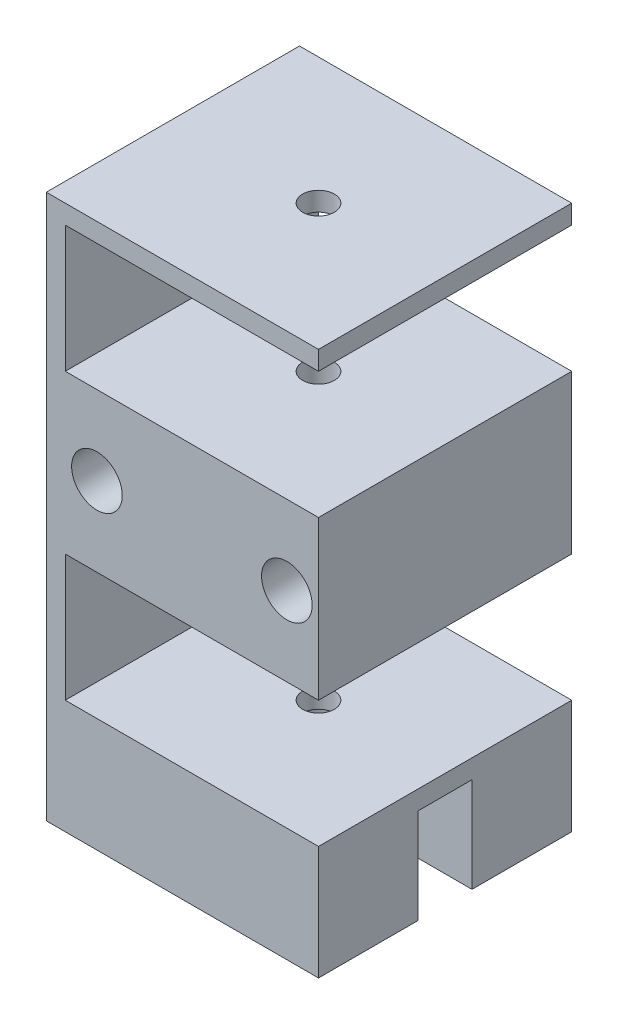
ISO-10303-21;
HEADER;
FILE_DESCRIPTION(('STEP AP214'),'2;1');
FILE_NAME('part.step','',(''),(''),'','','');
FILE_SCHEMA(('AUTOMOTIVE_DESIGN { 1 0 10303 214 1 1 1 1 }'));
ENDSEC;
DATA;
#1=APPLICATION_CONTEXT('core data for automotive mechanical design processes');
#2=APPLICATION_PROTOCOL_DEFINITION('international standard','automotive_design',2000,#1);
#3=PRODUCT_CONTEXT('',#1,'mechanical');
#4=PRODUCT('Part','Part','',(#3));
#5=PRODUCT_RELATED_PRODUCT_CATEGORY('part','',(#4));
#6=PRODUCT_DEFINITION_FORMATION('','',#4);
#7=PRODUCT_DEFINITION_CONTEXT('part definition',#1,'design');
#8=PRODUCT_DEFINITION('design','',#6,#7);
#9=PRODUCT_DEFINITION_SHAPE('','',#8);
#10=(LENGTH_UNIT() NAMED_UNIT(*) SI_UNIT(.MILLI.,.METRE.));
#11=(NAMED_UNIT(*) PLANE_ANGLE_UNIT() SI_UNIT($,.RADIAN.));
#12=(NAMED_UNIT(*) SI_UNIT($,.STERADIAN.) SOLID_ANGLE_UNIT());
#13=UNCERTAINTY_MEASURE_WITH_UNIT(LENGTH_MEASURE(1.E-05),#10,'distance_accuracy_value','');
#14=(GEOMETRIC_REPRESENTATION_CONTEXT(3) GLOBAL_UNCERTAINTY_ASSIGNED_CONTEXT((#13)) GLOBAL_UNIT_ASSIGNED_CONTEXT((#10,
#11,#12)) REPRESENTATION_CONTEXT('',''));
#15=CARTESIAN_POINT('',(0.,0.,0.));
#16=DIRECTION('',(0.,0.,1.));
#17=DIRECTION('',(1.,0.,0.));
#18=AXIS2_PLACEMENT_3D('',#15,#16,#17);
#19=CARTESIAN_POINT('',(-20.,68.,20.));
#20=DIRECTION('',(0.,-1.,0.));
#21=DIRECTION('',(1.,0.,0.));
#22=AXIS2_PLACEMENT_3D('',#19,#20,#21);
#23=CYLINDRICAL_SURFACE('',#22,2.5);
#24=CARTESIAN_POINT('',(-20.,0.,20.));
#25=DIRECTION('',(0.,-1.,0.));
#26=DIRECTION('',(1.,0.,0.));
#27=AXIS2_PLACEMENT_3D('',#24,#25,#26);
#28=CIRCLE('',#27,2.5);
#29=CARTESIAN_POINT('',(-17.5,0.,20.));
#30=VERTEX_POINT('',#29);
#31=EDGE_CURVE('E283',#30,#30,#28,.T.);
#32=ORIENTED_EDGE('',*,*,#31,.F.);
#33=EDGE_LOOP('',(#32));
#34=FACE_BOUND('',#33,.T.);
#35=CARTESIAN_POINT('',(-20.,-3.,20.));
#36=DIRECTION('',(0.,-1.,0.));
#37=DIRECTION('',(1.,0.,0.));
#38=AXIS2_PLACEMENT_3D('',#35,#36,#37);
#39=CIRCLE('',#38,2.5);
#40=CARTESIAN_POINT('',(-17.5,-3.,20.));
#41=VERTEX_POINT('',#40);
#42=EDGE_CURVE('E37',#41,#41,#39,.F.);
#43=ORIENTED_EDGE('',*,*,#42,.F.);
#44=EDGE_LOOP('',(#43));
#45=FACE_BOUND('',#44,.T.);
#46=ADVANCED_FACE('F33',(#34,#45),#23,.F.);
#47=CARTESIAN_POINT('',(0.,0.,40.));
#48=DIRECTION('',(0.,0.,-1.));
#49=DIRECTION('',(-1.,0.,0.));
#50=AXIS2_PLACEMENT_3D('',#47,#48,#49);
#51=PLANE('',#50);
#52=DIRECTION('',(0.,1.,0.));
#53=VECTOR('',#52,1.);
#54=CARTESIAN_POINT('',(0.,0.,40.));
#55=LINE('',#54,#53);
#56=CARTESIAN_POINT('',(0.,-18.,40.));
#57=VERTEX_POINT('',#56);
#58=CARTESIAN_POINT('',(0.,0.,40.));
#59=VERTEX_POINT('',#58);
#60=EDGE_CURVE('E193',#57,#59,#55,.T.);
#61=ORIENTED_EDGE('',*,*,#60,.T.);
#62=DIRECTION('',(-1.,0.,0.));
#63=VECTOR('',#62,1.);
#64=CARTESIAN_POINT('',(0.,0.,40.));
#65=LINE('',#64,#63);
#66=CARTESIAN_POINT('',(-40.,0.,40.));
#67=VERTEX_POINT('',#66);
#68=EDGE_CURVE('E112',#59,#67,#65,.T.);
#69=ORIENTED_EDGE('',*,*,#68,.T.);
#70=DIRECTION('',(0.,1.,0.));
#71=VECTOR('',#70,1.);
#72=CARTESIAN_POINT('',(-40.,0.,40.));
#73=LINE('',#72,#71);
#74=CARTESIAN_POINT('',(-40.,20.,40.));
#75=VERTEX_POINT('',#74);
#76=EDGE_CURVE('E223',#67,#75,#73,.T.);
#77=ORIENTED_EDGE('',*,*,#76,.T.);
#78=DIRECTION('',(1.,0.,0.));
#79=VECTOR('',#78,1.);
#80=CARTESIAN_POINT('',(-40.,20.,40.));
#81=LINE('',#80,#79);
#82=CARTESIAN_POINT('',(0.,20.,40.));
#83=VERTEX_POINT('',#82);
#84=EDGE_CURVE('E242',#75,#83,#81,.T.);
#85=ORIENTED_EDGE('',*,*,#84,.T.);
#86=DIRECTION('',(0.,1.,0.));
#87=VECTOR('',#86,1.);
#88=CARTESIAN_POINT('',(0.,20.,40.));
#89=LINE('',#88,#87);
#90=CARTESIAN_POINT('',(0.,45.,40.));
#91=VERTEX_POINT('',#90);
#92=EDGE_CURVE('E239',#83,#91,#89,.T.);
#93=ORIENTED_EDGE('',*,*,#92,.T.);
#94=DIRECTION('',(-1.,0.,0.));
#95=VECTOR('',#94,1.);
#96=CARTESIAN_POINT('',(0.,45.,40.));
#97=LINE('',#96,#95);
#98=CARTESIAN_POINT('',(-40.,45.,40.));
#99=VERTEX_POINT('',#98);
#100=EDGE_CURVE('E241',#91,#99,#97,.T.);
#101=ORIENTED_EDGE('',*,*,#100,.T.);
#102=DIRECTION('',(0.,1.,0.));
#103=VECTOR('',#102,1.);
#104=CARTESIAN_POINT('',(-40.,45.,40.));
#105=LINE('',#104,#103);
#106=CARTESIAN_POINT('',(-40.,65.,40.));
#107=VERTEX_POINT('',#106);
#108=EDGE_CURVE('E244',#99,#107,#105,.T.);
#109=ORIENTED_EDGE('',*,*,#108,.T.);
#110=DIRECTION('',(1.,0.,0.));
#111=VECTOR('',#110,1.);
#112=CARTESIAN_POINT('',(-40.,65.,40.));
#113=LINE('',#112,#111);
#114=CARTESIAN_POINT('',(0.,65.,40.));
#115=VERTEX_POINT('',#114);
#116=EDGE_CURVE('E250',#107,#115,#113,.T.);
#117=ORIENTED_EDGE('',*,*,#116,.T.);
#118=DIRECTION('',(0.,1.,0.));
#119=VECTOR('',#118,1.);
#120=CARTESIAN_POINT('',(0.,65.,40.));
#121=LINE('',#120,#119);
#122=CARTESIAN_POINT('',(0.,68.,40.));
#123=VERTEX_POINT('',#122);
#124=EDGE_CURVE('E148',#115,#123,#121,.T.);
#125=ORIENTED_EDGE('',*,*,#124,.T.);
#126=DIRECTION('',(-1.,0.,0.));
#127=VECTOR('',#126,1.);
#128=CARTESIAN_POINT('',(0.,68.,40.));
#129=LINE('',#128,#127);
#130=CARTESIAN_POINT('',(-43.,68.,40.));
#131=VERTEX_POINT('',#130);
#132=EDGE_CURVE('E140',#123,#131,#129,.T.);
#133=ORIENTED_EDGE('',*,*,#132,.T.);
#134=DIRECTION('',(0.,-1.,0.));
#135=VECTOR('',#134,1.);
#136=CARTESIAN_POINT('',(-43.,65.,40.));
#137=LINE('',#136,#135);
#138=CARTESIAN_POINT('',(-43.,-18.,40.));
#139=VERTEX_POINT('',#138);
#140=EDGE_CURVE('E145',#131,#139,#137,.T.);
#141=ORIENTED_EDGE('',*,*,#140,.T.);
#142=DIRECTION('',(1.,0.,0.));
#143=VECTOR('',#142,1.);
#144=CARTESIAN_POINT('',(0.,-18.,40.));
#145=LINE('',#144,#143);
#146=EDGE_CURVE('E58',#139,#57,#145,.T.);
#147=ORIENTED_EDGE('',*,*,#146,.T.);
#148=EDGE_LOOP('',(#61,#69,#77,#85,#93,#101,#109,#117,#125,#133,#141,#147));
#149=FACE_BOUND('',#148,.T.);
#150=CARTESIAN_POINT('',(-35.,32.5,40.));
#151=DIRECTION('',(0.,0.,1.));
#152=DIRECTION('',(1.,0.,0.));
#153=AXIS2_PLACEMENT_3D('',#150,#151,#152);
#154=CIRCLE('',#153,4.);
#155=CARTESIAN_POINT('',(-31.,32.5,40.));
#156=VERTEX_POINT('',#155);
#157=EDGE_CURVE('E172',#156,#156,#154,.T.);
#158=ORIENTED_EDGE('',*,*,#157,.F.);
#159=EDGE_LOOP('',(#158));
#160=FACE_BOUND('',#159,.T.);
#161=CARTESIAN_POINT('',(-5.,32.5,40.));
#162=DIRECTION('',(0.,0.,1.));
#163=DIRECTION('',(1.,0.,0.));
#164=AXIS2_PLACEMENT_3D('',#161,#162,#163);
#165=CIRCLE('',#164,4.);
#166=CARTESIAN_POINT('',(-0.999999999999997,32.5,40.));
#167=VERTEX_POINT('',#166);
#168=EDGE_CURVE('E277',#167,#167,#165,.T.);
#169=ORIENTED_EDGE('',*,*,#168,.F.);
#170=EDGE_LOOP('',(#169));
#171=FACE_BOUND('',#170,.T.);
#172=ADVANCED_FACE('F142',(#149,#160,#171),#51,.F.);
#173=CARTESIAN_POINT('',(0.,0.,0.));
#174=DIRECTION('',(0.,0.,-1.));
#175=DIRECTION('',(-1.,0.,0.));
#176=AXIS2_PLACEMENT_3D('',#173,#174,#175);
#177=PLANE('',#176);
#178=CARTESIAN_POINT('',(-35.,32.5,0.));
#179=DIRECTION('',(0.,0.,1.));
#180=DIRECTION('',(1.,0.,0.));
#181=AXIS2_PLACEMENT_3D('',#178,#179,#180);
#182=CIRCLE('',#181,4.);
#183=CARTESIAN_POINT('',(-31.,32.5,0.));
#184=VERTEX_POINT('',#183);
#185=EDGE_CURVE('E274',#184,#184,#182,.T.);
#186=ORIENTED_EDGE('',*,*,#185,.T.);
#187=EDGE_LOOP('',(#186));
#188=FACE_BOUND('',#187,.T.);
#189=DIRECTION('',(0.,1.,0.));
#190=VECTOR('',#189,1.);
#191=CARTESIAN_POINT('',(0.,0.,0.));
#192=LINE('',#191,#190);
#193=CARTESIAN_POINT('',(0.,-18.,0.));
#194=VERTEX_POINT('',#193);
#195=CARTESIAN_POINT('',(0.,0.,0.));
#196=VERTEX_POINT('',#195);
#197=EDGE_CURVE('E169',#194,#196,#192,.T.);
#198=ORIENTED_EDGE('',*,*,#197,.F.);
#199=DIRECTION('',(1.,0.,0.));
#200=VECTOR('',#199,1.);
#201=CARTESIAN_POINT('',(0.,-18.,0.));
#202=LINE('',#201,#200);
#203=CARTESIAN_POINT('',(-43.,-18.,0.));
#204=VERTEX_POINT('',#203);
#205=EDGE_CURVE('E191',#204,#194,#202,.T.);
#206=ORIENTED_EDGE('',*,*,#205,.F.);
#207=DIRECTION('',(0.,-1.,0.));
#208=VECTOR('',#207,1.);
#209=CARTESIAN_POINT('',(-43.,45.,0.));
#210=LINE('',#209,#208);
#211=CARTESIAN_POINT('',(-43.,68.,0.));
#212=VERTEX_POINT('',#211);
#213=EDGE_CURVE('E189',#212,#204,#210,.T.);
#214=ORIENTED_EDGE('',*,*,#213,.F.);
#215=DIRECTION('',(-1.,0.,0.));
#216=VECTOR('',#215,1.);
#217=CARTESIAN_POINT('',(0.,68.,0.));
#218=LINE('',#217,#216);
#219=CARTESIAN_POINT('',(0.,68.,0.));
#220=VERTEX_POINT('',#219);
#221=EDGE_CURVE('E158',#220,#212,#218,.T.);
#222=ORIENTED_EDGE('',*,*,#221,.F.);
#223=DIRECTION('',(0.,1.,0.));
#224=VECTOR('',#223,1.);
#225=CARTESIAN_POINT('',(0.,65.,0.));
#226=LINE('',#225,#224);
#227=CARTESIAN_POINT('',(0.,65.,0.));
#228=VERTEX_POINT('',#227);
#229=EDGE_CURVE('E186',#228,#220,#226,.T.);
#230=ORIENTED_EDGE('',*,*,#229,.F.);
#231=DIRECTION('',(1.,0.,0.));
#232=VECTOR('',#231,1.);
#233=CARTESIAN_POINT('',(-40.,65.,0.));
#234=LINE('',#233,#232);
#235=CARTESIAN_POINT('',(-40.,65.,0.));
#236=VERTEX_POINT('',#235);
#237=EDGE_CURVE('E184',#236,#228,#234,.T.);
#238=ORIENTED_EDGE('',*,*,#237,.F.);
#239=DIRECTION('',(0.,1.,0.));
#240=VECTOR('',#239,1.);
#241=CARTESIAN_POINT('',(-40.,45.,0.));
#242=LINE('',#241,#240);
#243=CARTESIAN_POINT('',(-40.,45.,0.));
#244=VERTEX_POINT('',#243);
#245=EDGE_CURVE('E182',#244,#236,#242,.T.);
#246=ORIENTED_EDGE('',*,*,#245,.F.);
#247=DIRECTION('',(-1.,0.,0.));
#248=VECTOR('',#247,1.);
#249=CARTESIAN_POINT('',(0.,45.,0.));
#250=LINE('',#249,#248);
#251=CARTESIAN_POINT('',(0.,45.,0.));
#252=VERTEX_POINT('',#251);
#253=EDGE_CURVE('E180',#252,#244,#250,.T.);
#254=ORIENTED_EDGE('',*,*,#253,.F.);
#255=DIRECTION('',(0.,1.,0.));
#256=VECTOR('',#255,1.);
#257=CARTESIAN_POINT('',(0.,20.,0.));
#258=LINE('',#257,#256);
#259=CARTESIAN_POINT('',(0.,20.,0.));
#260=VERTEX_POINT('',#259);
#261=EDGE_CURVE('E178',#260,#252,#258,.T.);
#262=ORIENTED_EDGE('',*,*,#261,.F.);
#263=DIRECTION('',(1.,0.,0.));
#264=VECTOR('',#263,1.);
#265=CARTESIAN_POINT('',(-40.,20.,0.));
#266=LINE('',#265,#264);
#267=CARTESIAN_POINT('',(-40.,20.,0.));
#268=VERTEX_POINT('',#267);
#269=EDGE_CURVE('E176',#268,#260,#266,.T.);
#270=ORIENTED_EDGE('',*,*,#269,.F.);
#271=DIRECTION('',(0.,1.,0.));
#272=VECTOR('',#271,1.);
#273=CARTESIAN_POINT('',(-40.,0.,0.));
#274=LINE('',#273,#272);
#275=CARTESIAN_POINT('',(-40.,0.,0.));
#276=VERTEX_POINT('',#275);
#277=EDGE_CURVE('E174',#276,#268,#274,.T.);
#278=ORIENTED_EDGE('',*,*,#277,.F.);
#279=DIRECTION('',(-1.,0.,0.));
#280=VECTOR('',#279,1.);
#281=CARTESIAN_POINT('',(0.,0.,0.));
#282=LINE('',#281,#280);
#283=EDGE_CURVE('E171',#196,#276,#282,.T.);
#284=ORIENTED_EDGE('',*,*,#283,.F.);
#285=EDGE_LOOP('',(#198,#206,#214,#222,#230,#238,#246,#254,#262,#270,#278,#284));
#286=FACE_BOUND('',#285,.T.);
#287=CARTESIAN_POINT('',(-5.,32.5,0.));
#288=DIRECTION('',(0.,0.,1.));
#289=DIRECTION('',(1.,0.,0.));
#290=AXIS2_PLACEMENT_3D('',#287,#288,#289);
#291=CIRCLE('',#290,4.);
#292=CARTESIAN_POINT('',(-0.999999999999997,32.5,0.));
#293=VERTEX_POINT('',#292);
#294=EDGE_CURVE('E280',#293,#293,#291,.T.);
#295=ORIENTED_EDGE('',*,*,#294,.T.);
#296=EDGE_LOOP('',(#295));
#297=FACE_BOUND('',#296,.T.);
#298=ADVANCED_FACE('F227',(#188,#286,#297),#177,.T.);
#299=CARTESIAN_POINT('',(0.,0.,40.));
#300=DIRECTION('',(-1.,0.,0.));
#301=DIRECTION('',(0.,-1.,0.));
#302=AXIS2_PLACEMENT_3D('',#299,#300,#301);
#303=PLANE('',#302);
#304=DIRECTION('',(0.,0.,-1.));
#305=VECTOR('',#304,1.);
#306=CARTESIAN_POINT('',(0.,-18.,40.));
#307=LINE('',#306,#305);
#308=CARTESIAN_POINT('',(0.,-18.,24.25));
#309=VERTEX_POINT('',#308);
#310=EDGE_CURVE('E194',#57,#309,#307,.T.);
#311=ORIENTED_EDGE('',*,*,#310,.T.);
#312=DIRECTION('',(0.,-1.,0.));
#313=VECTOR('',#312,1.);
#314=CARTESIAN_POINT('',(0.,-3.,24.25));
#315=LINE('',#314,#313);
#316=CARTESIAN_POINT('',(0.,-3.,24.25));
#317=VERTEX_POINT('',#316);
#318=EDGE_CURVE('E305',#317,#309,#315,.T.);
#319=ORIENTED_EDGE('',*,*,#318,.F.);
#320=DIRECTION('',(0.,0.,1.));
#321=VECTOR('',#320,1.);
#322=CARTESIAN_POINT('',(0.,-3.,24.25));
#323=LINE('',#322,#321);
#324=CARTESIAN_POINT('',(0.,-3.,15.75));
#325=VERTEX_POINT('',#324);
#326=EDGE_CURVE('E318',#325,#317,#323,.T.);
#327=ORIENTED_EDGE('',*,*,#326,.F.);
#328=DIRECTION('',(0.,-1.,0.));
#329=VECTOR('',#328,1.);
#330=CARTESIAN_POINT('',(0.,-3.,15.75));
#331=LINE('',#330,#329);
#332=CARTESIAN_POINT('',(0.,-18.,15.75));
#333=VERTEX_POINT('',#332);
#334=EDGE_CURVE('E302',#325,#333,#331,.T.);
#335=ORIENTED_EDGE('',*,*,#334,.T.);
#336=EDGE_CURVE('E104',#333,#194,#307,.T.);
#337=ORIENTED_EDGE('',*,*,#336,.T.);
#338=ORIENTED_EDGE('',*,*,#197,.T.);
#339=DIRECTION('',(0.,0.,-1.));
#340=VECTOR('',#339,1.);
#341=CARTESIAN_POINT('',(0.,0.,40.));
#342=LINE('',#341,#340);
#343=EDGE_CURVE('E11',#59,#196,#342,.T.);
#344=ORIENTED_EDGE('',*,*,#343,.F.);
#345=ORIENTED_EDGE('',*,*,#60,.F.);
#346=EDGE_LOOP('',(#311,#319,#327,#335,#337,#338,#344,#345));
#347=FACE_BOUND('',#346,.T.);
#348=ADVANCED_FACE('F35',(#347),#303,.F.);
#349=CARTESIAN_POINT('',(0.,0.,40.));
#350=DIRECTION('',(0.,-1.,0.));
#351=DIRECTION('',(1.,0.,0.));
#352=AXIS2_PLACEMENT_3D('',#349,#350,#351);
#353=PLANE('',#352);
#354=ORIENTED_EDGE('',*,*,#31,.T.);
#355=EDGE_LOOP('',(#354));
#356=FACE_BOUND('',#355,.T.);
#357=ORIENTED_EDGE('',*,*,#283,.T.);
#358=DIRECTION('',(0.,0.,-1.));
#359=VECTOR('',#358,1.);
#360=CARTESIAN_POINT('',(-40.,0.,40.));
#361=LINE('',#360,#359);
#362=EDGE_CURVE('E42',#67,#276,#361,.T.);
#363=ORIENTED_EDGE('',*,*,#362,.F.);
#364=ORIENTED_EDGE('',*,*,#68,.F.);
#365=ORIENTED_EDGE('',*,*,#343,.T.);
#366=EDGE_LOOP('',(#357,#363,#364,#365));
#367=FACE_BOUND('',#366,.T.);
#368=ADVANCED_FACE('F404',(#356,#367),#353,.F.);
#369=CARTESIAN_POINT('',(-40.,0.,40.));
#370=DIRECTION('',(-1.,0.,0.));
#371=DIRECTION('',(0.,0.,1.));
#372=AXIS2_PLACEMENT_3D('',#369,#370,#371);
#373=PLANE('',#372);
#374=ORIENTED_EDGE('',*,*,#277,.T.);
#375=DIRECTION('',(0.,0.,-1.));
#376=VECTOR('',#375,1.);
#377=CARTESIAN_POINT('',(-40.,20.,40.));
#378=LINE('',#377,#376);
#379=EDGE_CURVE('E214',#75,#268,#378,.T.);
#380=ORIENTED_EDGE('',*,*,#379,.F.);
#381=ORIENTED_EDGE('',*,*,#76,.F.);
#382=ORIENTED_EDGE('',*,*,#362,.T.);
#383=EDGE_LOOP('',(#374,#380,#381,#382));
#384=FACE_BOUND('',#383,.T.);
#385=ADVANCED_FACE('F221',(#384),#373,.F.);
#386=CARTESIAN_POINT('',(-40.,20.,40.));
#387=DIRECTION('',(0.,1.,0.));
#388=DIRECTION('',(-1.,0.,0.));
#389=AXIS2_PLACEMENT_3D('',#386,#387,#388);
#390=PLANE('',#389);
#391=CARTESIAN_POINT('',(-20.,20.,20.));
#392=DIRECTION('',(0.,1.,0.));
#393=DIRECTION('',(-1.,0.,0.));
#394=AXIS2_PLACEMENT_3D('',#391,#392,#393);
#395=CIRCLE('',#394,2.5);
#396=CARTESIAN_POINT('',(-22.5,20.,20.));
#397=VERTEX_POINT('',#396);
#398=EDGE_CURVE('E288',#397,#397,#395,.T.);
#399=ORIENTED_EDGE('',*,*,#398,.T.);
#400=EDGE_LOOP('',(#399));
#401=FACE_BOUND('',#400,.T.);
#402=ORIENTED_EDGE('',*,*,#269,.T.);
#403=DIRECTION('',(0.,0.,-1.));
#404=VECTOR('',#403,1.);
#405=CARTESIAN_POINT('',(0.,20.,40.));
#406=LINE('',#405,#404);
#407=EDGE_CURVE('E211',#83,#260,#406,.T.);
#408=ORIENTED_EDGE('',*,*,#407,.F.);
#409=ORIENTED_EDGE('',*,*,#84,.F.);
#410=ORIENTED_EDGE('',*,*,#379,.T.);
#411=EDGE_LOOP('',(#402,#408,#409,#410));
#412=FACE_BOUND('',#411,.T.);
#413=ADVANCED_FACE('F233',(#401,#412),#390,.F.);
#414=CARTESIAN_POINT('',(0.,20.,40.));
#415=DIRECTION('',(-1.,0.,0.));
#416=DIRECTION('',(0.,-1.,0.));
#417=AXIS2_PLACEMENT_3D('',#414,#415,#416);
#418=PLANE('',#417);
#419=ORIENTED_EDGE('',*,*,#261,.T.);
#420=DIRECTION('',(0.,0.,-1.));
#421=VECTOR('',#420,1.);
#422=CARTESIAN_POINT('',(0.,45.,40.));
#423=LINE('',#422,#421);
#424=EDGE_CURVE('E208',#91,#252,#423,.T.);
#425=ORIENTED_EDGE('',*,*,#424,.F.);
#426=ORIENTED_EDGE('',*,*,#92,.F.);
#427=ORIENTED_EDGE('',*,*,#407,.T.);
#428=EDGE_LOOP('',(#419,#425,#426,#427));
#429=FACE_BOUND('',#428,.T.);
#430=ADVANCED_FACE('F237',(#429),#418,.F.);
#431=CARTESIAN_POINT('',(0.,45.,40.));
#432=DIRECTION('',(0.,-1.,0.));
#433=DIRECTION('',(0.,0.,-1.));
#434=AXIS2_PLACEMENT_3D('',#431,#432,#433);
#435=PLANE('',#434);
#436=CARTESIAN_POINT('',(-20.,45.,20.));
#437=DIRECTION('',(0.,-1.,0.));
#438=DIRECTION('',(0.,0.,-1.));
#439=AXIS2_PLACEMENT_3D('',#436,#437,#438);
#440=CIRCLE('',#439,2.5);
#441=CARTESIAN_POINT('',(-20.,45.,17.5));
#442=VERTEX_POINT('',#441);
#443=EDGE_CURVE('E291',#442,#442,#440,.T.);
#444=ORIENTED_EDGE('',*,*,#443,.T.);
#445=EDGE_LOOP('',(#444));
#446=FACE_BOUND('',#445,.T.);
#447=ORIENTED_EDGE('',*,*,#253,.T.);
#448=DIRECTION('',(0.,0.,-1.));
#449=VECTOR('',#448,1.);
#450=CARTESIAN_POINT('',(-40.,45.,40.));
#451=LINE('',#450,#449);
#452=EDGE_CURVE('E205',#99,#244,#451,.T.);
#453=ORIENTED_EDGE('',*,*,#452,.F.);
#454=ORIENTED_EDGE('',*,*,#100,.F.);
#455=ORIENTED_EDGE('',*,*,#424,.T.);
#456=EDGE_LOOP('',(#447,#453,#454,#455));
#457=FACE_BOUND('',#456,.T.);
#458=ADVANCED_FACE('F390',(#446,#457),#435,.F.);
#459=CARTESIAN_POINT('',(-40.,45.,40.));
#460=DIRECTION('',(-1.,0.,0.));
#461=DIRECTION('',(0.,0.,1.));
#462=AXIS2_PLACEMENT_3D('',#459,#460,#461);
#463=PLANE('',#462);
#464=ORIENTED_EDGE('',*,*,#245,.T.);
#465=DIRECTION('',(0.,0.,-1.));
#466=VECTOR('',#465,1.);
#467=CARTESIAN_POINT('',(-40.,65.,40.));
#468=LINE('',#467,#466);
#469=EDGE_CURVE('E202',#107,#236,#468,.T.);
#470=ORIENTED_EDGE('',*,*,#469,.F.);
#471=ORIENTED_EDGE('',*,*,#108,.F.);
#472=ORIENTED_EDGE('',*,*,#452,.T.);
#473=EDGE_LOOP('',(#464,#470,#471,#472));
#474=FACE_BOUND('',#473,.T.);
#475=ADVANCED_FACE('F383',(#474),#463,.F.);
#476=CARTESIAN_POINT('',(-40.,65.,40.));
#477=DIRECTION('',(0.,1.,0.));
#478=DIRECTION('',(0.,0.,1.));
#479=AXIS2_PLACEMENT_3D('',#476,#477,#478);
#480=PLANE('',#479);
#481=CARTESIAN_POINT('',(-20.,65.,20.));
#482=DIRECTION('',(0.,1.,0.));
#483=DIRECTION('',(0.,0.,1.));
#484=AXIS2_PLACEMENT_3D('',#481,#482,#483);
#485=CIRCLE('',#484,2.5);
#486=CARTESIAN_POINT('',(-20.,65.,22.5));
#487=VERTEX_POINT('',#486);
#488=EDGE_CURVE('E294',#487,#487,#485,.T.);
#489=ORIENTED_EDGE('',*,*,#488,.T.);
#490=EDGE_LOOP('',(#489));
#491=FACE_BOUND('',#490,.T.);
#492=ORIENTED_EDGE('',*,*,#237,.T.);
#493=DIRECTION('',(0.,0.,-1.));
#494=VECTOR('',#493,1.);
#495=CARTESIAN_POINT('',(0.,65.,40.));
#496=LINE('',#495,#494);
#497=EDGE_CURVE('E199',#115,#228,#496,.T.);
#498=ORIENTED_EDGE('',*,*,#497,.F.);
#499=ORIENTED_EDGE('',*,*,#116,.F.);
#500=ORIENTED_EDGE('',*,*,#469,.T.);
#501=EDGE_LOOP('',(#492,#498,#499,#500));
#502=FACE_BOUND('',#501,.T.);
#503=ADVANCED_FACE('F256',(#491,#502),#480,.F.);
#504=CARTESIAN_POINT('',(0.,65.,40.));
#505=DIRECTION('',(-1.,0.,0.));
#506=DIRECTION('',(0.,-1.,0.));
#507=AXIS2_PLACEMENT_3D('',#504,#505,#506);
#508=PLANE('',#507);
#509=ORIENTED_EDGE('',*,*,#229,.T.);
#510=DIRECTION('',(0.,0.,-1.));
#511=VECTOR('',#510,1.);
#512=CARTESIAN_POINT('',(0.,68.,40.));
#513=LINE('',#512,#511);
#514=EDGE_CURVE('E160',#123,#220,#513,.T.);
#515=ORIENTED_EDGE('',*,*,#514,.F.);
#516=ORIENTED_EDGE('',*,*,#124,.F.);
#517=ORIENTED_EDGE('',*,*,#497,.T.);
#518=EDGE_LOOP('',(#509,#515,#516,#517));
#519=FACE_BOUND('',#518,.T.);
#520=ADVANCED_FACE('F260',(#519),#508,.F.);
#521=CARTESIAN_POINT('',(0.,68.,40.));
#522=DIRECTION('',(0.,-1.,0.));
#523=DIRECTION('',(0.,0.,-1.));
#524=AXIS2_PLACEMENT_3D('',#521,#522,#523);
#525=PLANE('',#524);
#526=CARTESIAN_POINT('',(-20.,68.,20.));
#527=DIRECTION('',(0.,-1.,0.));
#528=DIRECTION('',(1.,0.,0.));
#529=AXIS2_PLACEMENT_3D('',#526,#527,#528);
#530=CIRCLE('',#529,2.5);
#531=CARTESIAN_POINT('',(-17.5,68.,20.));
#532=VERTEX_POINT('',#531);
#533=EDGE_CURVE('E297',#532,#532,#530,.T.);
#534=ORIENTED_EDGE('',*,*,#533,.T.);
#535=EDGE_LOOP('',(#534));
#536=FACE_BOUND('',#535,.T.);
#537=ORIENTED_EDGE('',*,*,#221,.T.);
#538=DIRECTION('',(0.,0.,-1.));
#539=VECTOR('',#538,1.);
#540=CARTESIAN_POINT('',(-43.,68.,40.));
#541=LINE('',#540,#539);
#542=EDGE_CURVE('E155',#131,#212,#541,.T.);
#543=ORIENTED_EDGE('',*,*,#542,.F.);
#544=ORIENTED_EDGE('',*,*,#132,.F.);
#545=ORIENTED_EDGE('',*,*,#514,.T.);
#546=EDGE_LOOP('',(#537,#543,#544,#545));
#547=FACE_BOUND('',#546,.T.);
#548=ADVANCED_FACE('F156',(#536,#547),#525,.F.);
#549=CARTESIAN_POINT('',(-43.,45.,40.));
#550=DIRECTION('',(1.,0.,0.));
#551=DIRECTION('',(0.,1.,0.));
#552=AXIS2_PLACEMENT_3D('',#549,#550,#551);
#553=PLANE('',#552);
#554=ORIENTED_EDGE('',*,*,#213,.T.);
#555=DIRECTION('',(0.,0.,-1.));
#556=VECTOR('',#555,1.);
#557=CARTESIAN_POINT('',(-43.,-18.,40.));
#558=LINE('',#557,#556);
#559=EDGE_CURVE('E161',#139,#204,#558,.T.);
#560=ORIENTED_EDGE('',*,*,#559,.F.);
#561=ORIENTED_EDGE('',*,*,#140,.F.);
#562=ORIENTED_EDGE('',*,*,#542,.T.);
#563=EDGE_LOOP('',(#554,#560,#561,#562));
#564=FACE_BOUND('',#563,.T.);
#565=ADVANCED_FACE('F163',(#564),#553,.F.);
#566=CARTESIAN_POINT('',(0.,-18.,40.));
#567=DIRECTION('',(0.,1.,0.));
#568=DIRECTION('',(-1.,0.,0.));
#569=AXIS2_PLACEMENT_3D('',#566,#567,#568);
#570=PLANE('',#569);
#571=CARTESIAN_POINT('',(-20.,-18.,20.));
#572=DIRECTION('',(0.,-1.,0.));
#573=DIRECTION('',(1.,0.,0.));
#574=AXIS2_PLACEMENT_3D('',#571,#572,#573);
#575=CIRCLE('',#574,4.25);
#576=CARTESIAN_POINT('',(-20.,-18.,24.25));
#577=VERTEX_POINT('',#576);
#578=CARTESIAN_POINT('',(-20.,-18.,15.75));
#579=VERTEX_POINT('',#578);
#580=EDGE_CURVE('E49',#577,#579,#575,.T.);
#581=ORIENTED_EDGE('',*,*,#580,.F.);
#582=DIRECTION('',(-1.,0.,0.));
#583=VECTOR('',#582,1.);
#584=CARTESIAN_POINT('',(-20.,-18.,24.25));
#585=LINE('',#584,#583);
#586=EDGE_CURVE('E268',#309,#577,#585,.T.);
#587=ORIENTED_EDGE('',*,*,#586,.F.);
#588=ORIENTED_EDGE('',*,*,#310,.F.);
#589=ORIENTED_EDGE('',*,*,#146,.F.);
#590=ORIENTED_EDGE('',*,*,#559,.T.);
#591=ORIENTED_EDGE('',*,*,#205,.T.);
#592=ORIENTED_EDGE('',*,*,#336,.F.);
#593=DIRECTION('',(1.,0.,0.));
#594=VECTOR('',#593,1.);
#595=CARTESIAN_POINT('',(0.,-18.,15.75));
#596=LINE('',#595,#594);
#597=EDGE_CURVE('E312',#579,#333,#596,.T.);
#598=ORIENTED_EDGE('',*,*,#597,.F.);
#599=EDGE_LOOP('',(#581,#587,#588,#589,#590,#591,#592,#598));
#600=FACE_BOUND('',#599,.T.);
#601=ADVANCED_FACE('F263',(#600),#570,.F.);
#602=CARTESIAN_POINT('',(-35.,32.5,40.));
#603=DIRECTION('',(0.,0.,-1.));
#604=DIRECTION('',(-1.,0.,0.));
#605=AXIS2_PLACEMENT_3D('',#602,#603,#604);
#606=CYLINDRICAL_SURFACE('',#605,4.);
#607=ORIENTED_EDGE('',*,*,#157,.T.);
#608=EDGE_LOOP('',(#607));
#609=FACE_BOUND('',#608,.T.);
#610=ORIENTED_EDGE('',*,*,#185,.F.);
#611=EDGE_LOOP('',(#610));
#612=FACE_BOUND('',#611,.T.);
#613=ADVANCED_FACE('F376',(#609,#612),#606,.F.);
#614=CARTESIAN_POINT('',(-5.,32.5,40.));
#615=DIRECTION('',(0.,0.,-1.));
#616=DIRECTION('',(-1.,0.,0.));
#617=AXIS2_PLACEMENT_3D('',#614,#615,#616);
#618=CYLINDRICAL_SURFACE('',#617,4.);
#619=ORIENTED_EDGE('',*,*,#168,.T.);
#620=EDGE_LOOP('',(#619));
#621=FACE_BOUND('',#620,.T.);
#622=ORIENTED_EDGE('',*,*,#294,.F.);
#623=EDGE_LOOP('',(#622));
#624=FACE_BOUND('',#623,.T.);
#625=ADVANCED_FACE('F371',(#621,#624),#618,.F.);
#626=ORIENTED_EDGE('',*,*,#533,.F.);
#627=EDGE_LOOP('',(#626));
#628=FACE_BOUND('',#627,.T.);
#629=ORIENTED_EDGE('',*,*,#488,.F.);
#630=EDGE_LOOP('',(#629));
#631=FACE_BOUND('',#630,.T.);
#632=ADVANCED_FACE('F360',(#628,#631),#23,.F.);
#633=ORIENTED_EDGE('',*,*,#443,.F.);
#634=EDGE_LOOP('',(#633));
#635=FACE_BOUND('',#634,.T.);
#636=ORIENTED_EDGE('',*,*,#398,.F.);
#637=EDGE_LOOP('',(#636));
#638=FACE_BOUND('',#637,.T.);
#639=ADVANCED_FACE('F359',(#635,#638),#23,.F.);
#640=CARTESIAN_POINT('',(-20.,-3.,20.));
#641=DIRECTION('',(0.,-1.,0.));
#642=DIRECTION('',(1.,0.,0.));
#643=AXIS2_PLACEMENT_3D('',#640,#641,#642);
#644=PLANE('',#643);
#645=CARTESIAN_POINT('',(-20.,-3.,20.));
#646=DIRECTION('',(0.,-1.,0.));
#647=DIRECTION('',(1.,0.,0.));
#648=AXIS2_PLACEMENT_3D('',#645,#646,#647);
#649=CIRCLE('',#648,4.25);
#650=CARTESIAN_POINT('',(-20.,-3.,24.25));
#651=VERTEX_POINT('',#650);
#652=CARTESIAN_POINT('',(-20.,-3.,15.75));
#653=VERTEX_POINT('',#652);
#654=EDGE_CURVE('E311',#651,#653,#649,.T.);
#655=ORIENTED_EDGE('',*,*,#654,.T.);
#656=DIRECTION('',(1.,0.,0.));
#657=VECTOR('',#656,1.);
#658=CARTESIAN_POINT('',(0.,-3.,15.75));
#659=LINE('',#658,#657);
#660=EDGE_CURVE('E321',#653,#325,#659,.T.);
#661=ORIENTED_EDGE('',*,*,#660,.T.);
#662=ORIENTED_EDGE('',*,*,#326,.T.);
#663=DIRECTION('',(-1.,0.,0.));
#664=VECTOR('',#663,1.);
#665=CARTESIAN_POINT('',(-20.,-3.,24.25));
#666=LINE('',#665,#664);
#667=EDGE_CURVE('E303',#317,#651,#666,.T.);
#668=ORIENTED_EDGE('',*,*,#667,.T.);
#669=EDGE_LOOP('',(#655,#661,#662,#668));
#670=FACE_BOUND('',#669,.T.);
#671=ORIENTED_EDGE('',*,*,#42,.T.);
#672=EDGE_LOOP('',(#671));
#673=FACE_BOUND('',#672,.T.);
#674=ADVANCED_FACE('F328',(#670,#673),#644,.T.);
#675=CARTESIAN_POINT('',(-20.,-3.,20.));
#676=DIRECTION('',(0.,-1.,0.));
#677=DIRECTION('',(1.,0.,0.));
#678=AXIS2_PLACEMENT_3D('',#675,#676,#677);
#679=CYLINDRICAL_SURFACE('',#678,4.25);
#680=ORIENTED_EDGE('',*,*,#580,.T.);
#681=DIRECTION('',(0.,-1.,0.));
#682=VECTOR('',#681,1.);
#683=CARTESIAN_POINT('',(-20.,-3.,15.75));
#684=LINE('',#683,#682);
#685=EDGE_CURVE('E300',#653,#579,#684,.T.);
#686=ORIENTED_EDGE('',*,*,#685,.F.);
#687=ORIENTED_EDGE('',*,*,#654,.F.);
#688=DIRECTION('',(0.,-1.,0.));
#689=VECTOR('',#688,1.);
#690=CARTESIAN_POINT('',(-20.,-3.,24.25));
#691=LINE('',#690,#689);
#692=EDGE_CURVE('E308',#651,#577,#691,.T.);
#693=ORIENTED_EDGE('',*,*,#692,.T.);
#694=EDGE_LOOP('',(#680,#686,#687,#693));
#695=FACE_BOUND('',#694,.T.);
#696=ADVANCED_FACE('F335',(#695),#679,.F.);
#697=CARTESIAN_POINT('',(-20.,-3.,24.25));
#698=DIRECTION('',(0.,0.,1.));
#699=DIRECTION('',(1.,0.,0.));
#700=AXIS2_PLACEMENT_3D('',#697,#698,#699);
#701=PLANE('',#700);
#702=ORIENTED_EDGE('',*,*,#586,.T.);
#703=ORIENTED_EDGE('',*,*,#692,.F.);
#704=ORIENTED_EDGE('',*,*,#667,.F.);
#705=ORIENTED_EDGE('',*,*,#318,.T.);
#706=EDGE_LOOP('',(#702,#703,#704,#705));
#707=FACE_BOUND('',#706,.T.);
#708=ADVANCED_FACE('F344',(#707),#701,.F.);
#709=CARTESIAN_POINT('',(0.,-3.,15.75));
#710=DIRECTION('',(0.,0.,-1.));
#711=DIRECTION('',(-1.,0.,0.));
#712=AXIS2_PLACEMENT_3D('',#709,#710,#711);
#713=PLANE('',#712);
#714=ORIENTED_EDGE('',*,*,#597,.T.);
#715=ORIENTED_EDGE('',*,*,#334,.F.);
#716=ORIENTED_EDGE('',*,*,#660,.F.);
#717=ORIENTED_EDGE('',*,*,#685,.T.);
#718=EDGE_LOOP('',(#714,#715,#716,#717));
#719=FACE_BOUND('',#718,.T.);
#720=ADVANCED_FACE('F347',(#719),#713,.F.);
#721=CLOSED_SHELL('',(#46,#172,#298,#348,#368,#385,#413,#430,#458,#475,#503,#520,#548,#565,#601,
#613,#625,#632,#639,#674,#696,#708,#720));
#722=MANIFOLD_SOLID_BREP('B2',#721);
#723=ADVANCED_BREP_SHAPE_REPRESENTATION('',(#18,#722),#14);
#724=SHAPE_DEFINITION_REPRESENTATION(#9,#723);
ENDSEC;
END-ISO-10303-21;
